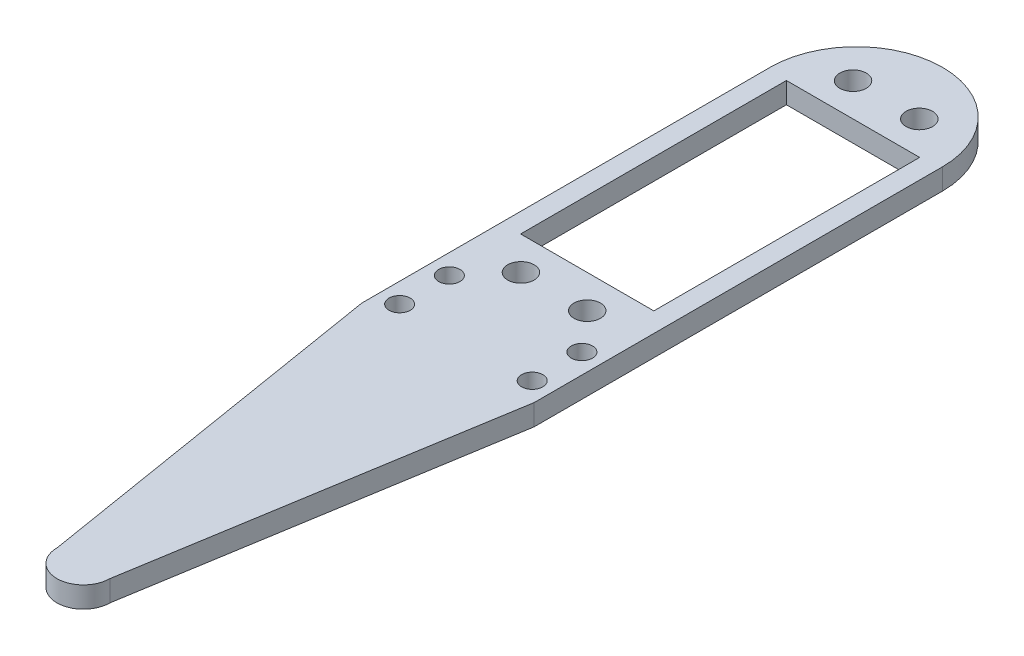
ISO-10303-21;
HEADER;
FILE_DESCRIPTION(('STEP AP214'),'2;1');
FILE_NAME('part.step','',(''),(''),'','','');
FILE_SCHEMA(('AUTOMOTIVE_DESIGN { 1 0 10303 214 1 1 1 1 }'));
ENDSEC;
DATA;
#1=APPLICATION_CONTEXT('core data for automotive mechanical design processes');
#2=APPLICATION_PROTOCOL_DEFINITION('international standard','automotive_design',2000,#1);
#3=PRODUCT_CONTEXT('',#1,'mechanical');
#4=PRODUCT('Part','Part','',(#3));
#5=PRODUCT_RELATED_PRODUCT_CATEGORY('part','',(#4));
#6=PRODUCT_DEFINITION_FORMATION('','',#4);
#7=PRODUCT_DEFINITION_CONTEXT('part definition',#1,'design');
#8=PRODUCT_DEFINITION('design','',#6,#7);
#9=PRODUCT_DEFINITION_SHAPE('','',#8);
#10=(LENGTH_UNIT() NAMED_UNIT(*) SI_UNIT(.MILLI.,.METRE.));
#11=(NAMED_UNIT(*) PLANE_ANGLE_UNIT() SI_UNIT($,.RADIAN.));
#12=(NAMED_UNIT(*) SI_UNIT($,.STERADIAN.) SOLID_ANGLE_UNIT());
#13=UNCERTAINTY_MEASURE_WITH_UNIT(LENGTH_MEASURE(1.E-05),#10,'distance_accuracy_value','');
#14=(GEOMETRIC_REPRESENTATION_CONTEXT(3) GLOBAL_UNCERTAINTY_ASSIGNED_CONTEXT((#13)) GLOBAL_UNIT_ASSIGNED_CONTEXT((#10,
#11,#12)) REPRESENTATION_CONTEXT('',''));
#15=CARTESIAN_POINT('',(0.,0.,0.));
#16=DIRECTION('',(0.,0.,1.));
#17=DIRECTION('',(1.,0.,0.));
#18=AXIS2_PLACEMENT_3D('',#15,#16,#17);
#19=CARTESIAN_POINT('',(0.,3.175,0.));
#20=DIRECTION('',(0.,1.,0.));
#21=DIRECTION('',(0.,0.,1.));
#22=AXIS2_PLACEMENT_3D('',#19,#20,#21);
#23=PLANE('',#22);
#24=CARTESIAN_POINT('',(10.,3.175,51.4));
#25=DIRECTION('',(0.,1.,0.));
#26=DIRECTION('',(0.,0.,1.));
#27=AXIS2_PLACEMENT_3D('',#24,#25,#26);
#28=CIRCLE('',#27,1.6);
#29=CARTESIAN_POINT('',(10.,3.175,53.));
#30=VERTEX_POINT('',#29);
#31=EDGE_CURVE('E317',#30,#30,#28,.T.);
#32=ORIENTED_EDGE('',*,*,#31,.F.);
#33=EDGE_LOOP('',(#32));
#34=FACE_BOUND('',#33,.T.);
#35=CARTESIAN_POINT('',(-9.99999999999997,3.175,58.9));
#36=DIRECTION('',(0.,1.,0.));
#37=DIRECTION('',(0.,0.,1.));
#38=AXIS2_PLACEMENT_3D('',#35,#36,#37);
#39=CIRCLE('',#38,1.6);
#40=CARTESIAN_POINT('',(-9.99999999999997,3.175,60.5));
#41=VERTEX_POINT('',#40);
#42=EDGE_CURVE('E314',#41,#41,#39,.T.);
#43=ORIENTED_EDGE('',*,*,#42,.F.);
#44=EDGE_LOOP('',(#43));
#45=FACE_BOUND('',#44,.T.);
#46=CARTESIAN_POINT('',(-9.99999999999997,3.175,51.4));
#47=DIRECTION('',(0.,1.,0.));
#48=DIRECTION('',(0.,0.,1.));
#49=AXIS2_PLACEMENT_3D('',#46,#47,#48);
#50=CIRCLE('',#49,1.6);
#51=CARTESIAN_POINT('',(-9.99999999999997,3.175,53.));
#52=VERTEX_POINT('',#51);
#53=EDGE_CURVE('E294',#52,#52,#50,.T.);
#54=ORIENTED_EDGE('',*,*,#53,.F.);
#55=EDGE_LOOP('',(#54));
#56=FACE_BOUND('',#55,.T.);
#57=CARTESIAN_POINT('',(10.,3.175,58.9));
#58=DIRECTION('',(0.,1.,0.));
#59=DIRECTION('',(0.,0.,1.));
#60=AXIS2_PLACEMENT_3D('',#57,#58,#59);
#61=CIRCLE('',#60,1.6);
#62=CARTESIAN_POINT('',(10.,3.175,60.5));
#63=VERTEX_POINT('',#62);
#64=EDGE_CURVE('E310',#63,#63,#61,.T.);
#65=ORIENTED_EDGE('',*,*,#64,.F.);
#66=EDGE_LOOP('',(#65));
#67=FACE_BOUND('',#66,.T.);
#68=CARTESIAN_POINT('',(5.,3.175,45.6));
#69=DIRECTION('',(0.,1.,0.));
#70=DIRECTION('',(0.,0.,-1.));
#71=AXIS2_PLACEMENT_3D('',#68,#69,#70);
#72=CIRCLE('',#71,2.);
#73=CARTESIAN_POINT('',(5.,3.175,43.6));
#74=VERTEX_POINT('',#73);
#75=EDGE_CURVE('E139',#74,#74,#72,.T.);
#76=ORIENTED_EDGE('',*,*,#75,.F.);
#77=EDGE_LOOP('',(#76));
#78=FACE_BOUND('',#77,.T.);
#79=CARTESIAN_POINT('',(-5.,3.175,-4.5));
#80=DIRECTION('',(0.,1.,0.));
#81=DIRECTION('',(0.,0.,1.));
#82=AXIS2_PLACEMENT_3D('',#79,#80,#81);
#83=CIRCLE('',#82,2.);
#84=CARTESIAN_POINT('',(-5.,3.175,-2.5));
#85=VERTEX_POINT('',#84);
#86=EDGE_CURVE('E155',#85,#85,#83,.T.);
#87=ORIENTED_EDGE('',*,*,#86,.F.);
#88=EDGE_LOOP('',(#87));
#89=FACE_BOUND('',#88,.T.);
#90=CARTESIAN_POINT('',(0.,3.175,0.));
#91=DIRECTION('',(0.,1.,0.));
#92=DIRECTION('',(0.,0.,1.));
#93=AXIS2_PLACEMENT_3D('',#90,#91,#92);
#94=CIRCLE('',#93,13.);
#95=CARTESIAN_POINT('',(13.,3.175,0.));
#96=VERTEX_POINT('',#95);
#97=CARTESIAN_POINT('',(-13.,3.175,0.));
#98=VERTEX_POINT('',#97);
#99=EDGE_CURVE('E161',#96,#98,#94,.T.);
#100=ORIENTED_EDGE('',*,*,#99,.T.);
#101=DIRECTION('',(0.,0.,1.));
#102=VECTOR('',#101,1.);
#103=CARTESIAN_POINT('',(-13.,3.175,0.));
#104=LINE('',#103,#102);
#105=CARTESIAN_POINT('',(-13.,3.175,61.6));
#106=VERTEX_POINT('',#105);
#107=EDGE_CURVE('E164',#98,#106,#104,.T.);
#108=ORIENTED_EDGE('',*,*,#107,.T.);
#109=DIRECTION('',(0.161488568110541,0.,0.986874582897749));
#110=VECTOR('',#109,1.);
#111=CARTESIAN_POINT('',(-13.,3.175,61.6));
#112=LINE('',#111,#110);
#113=CARTESIAN_POINT('',(-3.99999999999998,3.175,116.6));
#114=VERTEX_POINT('',#113);
#115=EDGE_CURVE('E167',#106,#114,#112,.T.);
#116=ORIENTED_EDGE('',*,*,#115,.T.);
#117=CARTESIAN_POINT('',(0.,3.175,116.6));
#118=DIRECTION('',(0.,1.,0.));
#119=DIRECTION('',(0.,0.,1.));
#120=AXIS2_PLACEMENT_3D('',#117,#118,#119);
#121=CIRCLE('',#120,4.);
#122=CARTESIAN_POINT('',(4.00000000000002,3.175,116.6));
#123=VERTEX_POINT('',#122);
#124=EDGE_CURVE('E169',#114,#123,#121,.T.);
#125=ORIENTED_EDGE('',*,*,#124,.T.);
#126=DIRECTION('',(0.16148856811054,0.,-0.98687458289775));
#127=VECTOR('',#126,1.);
#128=CARTESIAN_POINT('',(13.,3.175,61.6));
#129=LINE('',#128,#127);
#130=CARTESIAN_POINT('',(13.,3.175,61.6));
#131=VERTEX_POINT('',#130);
#132=EDGE_CURVE('E171',#123,#131,#129,.T.);
#133=ORIENTED_EDGE('',*,*,#132,.T.);
#134=DIRECTION('',(0.,0.,-1.));
#135=VECTOR('',#134,1.);
#136=CARTESIAN_POINT('',(13.,3.175,0.));
#137=LINE('',#136,#135);
#138=EDGE_CURVE('E173',#131,#96,#137,.T.);
#139=ORIENTED_EDGE('',*,*,#138,.T.);
#140=EDGE_LOOP('',(#100,#108,#116,#125,#133,#139));
#141=FACE_BOUND('',#140,.T.);
#142=CARTESIAN_POINT('',(-5.,3.175,45.6));
#143=DIRECTION('',(0.,1.,0.));
#144=DIRECTION('',(0.,0.,1.));
#145=AXIS2_PLACEMENT_3D('',#142,#143,#144);
#146=CIRCLE('',#145,2.);
#147=CARTESIAN_POINT('',(-5.,3.175,47.6));
#148=VERTEX_POINT('',#147);
#149=EDGE_CURVE('E149',#148,#148,#146,.T.);
#150=ORIENTED_EDGE('',*,*,#149,.F.);
#151=EDGE_LOOP('',(#150));
#152=FACE_BOUND('',#151,.T.);
#153=DIRECTION('',(-1.,0.,0.));
#154=VECTOR('',#153,1.);
#155=CARTESIAN_POINT('',(-10.05,3.175,0.5));
#156=LINE('',#155,#154);
#157=CARTESIAN_POINT('',(10.05,3.175,0.5));
#158=VERTEX_POINT('',#157);
#159=CARTESIAN_POINT('',(-10.05,3.175,0.5));
#160=VERTEX_POINT('',#159);
#161=EDGE_CURVE('E118',#158,#160,#156,.T.);
#162=ORIENTED_EDGE('',*,*,#161,.F.);
#163=DIRECTION('',(0.,0.,-1.));
#164=VECTOR('',#163,1.);
#165=CARTESIAN_POINT('',(10.05,3.175,0.5));
#166=LINE('',#165,#164);
#167=CARTESIAN_POINT('',(10.05,3.175,40.6));
#168=VERTEX_POINT('',#167);
#169=EDGE_CURVE('E110',#168,#158,#166,.T.);
#170=ORIENTED_EDGE('',*,*,#169,.F.);
#171=DIRECTION('',(1.,0.,0.));
#172=VECTOR('',#171,1.);
#173=CARTESIAN_POINT('',(-10.05,3.175,40.6));
#174=LINE('',#173,#172);
#175=CARTESIAN_POINT('',(-10.05,3.175,40.6));
#176=VERTEX_POINT('',#175);
#177=EDGE_CURVE('E133',#176,#168,#174,.T.);
#178=ORIENTED_EDGE('',*,*,#177,.F.);
#179=DIRECTION('',(0.,0.,1.));
#180=VECTOR('',#179,1.);
#181=CARTESIAN_POINT('',(-10.05,3.175,0.5));
#182=LINE('',#181,#180);
#183=EDGE_CURVE('E131',#160,#176,#182,.T.);
#184=ORIENTED_EDGE('',*,*,#183,.F.);
#185=EDGE_LOOP('',(#162,#170,#178,#184));
#186=FACE_BOUND('',#185,.T.);
#187=CARTESIAN_POINT('',(5.,3.175,-4.5));
#188=DIRECTION('',(0.,1.,0.));
#189=DIRECTION('',(0.,0.,-1.));
#190=AXIS2_PLACEMENT_3D('',#187,#188,#189);
#191=CIRCLE('',#190,2.);
#192=CARTESIAN_POINT('',(5.,3.175,-6.5));
#193=VERTEX_POINT('',#192);
#194=EDGE_CURVE('E321',#193,#193,#191,.T.);
#195=ORIENTED_EDGE('',*,*,#194,.F.);
#196=EDGE_LOOP('',(#195));
#197=FACE_BOUND('',#196,.T.);
#198=ADVANCED_FACE('F33',(#34,#45,#56,#67,#78,#89,#141,#152,#186,#197),#23,.T.);
#199=CARTESIAN_POINT('',(0.,0.,0.));
#200=DIRECTION('',(0.,1.,0.));
#201=DIRECTION('',(0.,0.,1.));
#202=AXIS2_PLACEMENT_3D('',#199,#200,#201);
#203=PLANE('',#202);
#204=CARTESIAN_POINT('',(10.,0.,51.4));
#205=DIRECTION('',(0.,1.,0.));
#206=DIRECTION('',(0.,0.,1.));
#207=AXIS2_PLACEMENT_3D('',#204,#205,#206);
#208=CIRCLE('',#207,1.6);
#209=CARTESIAN_POINT('',(10.,0.,53.));
#210=VERTEX_POINT('',#209);
#211=EDGE_CURVE('E302',#210,#210,#208,.T.);
#212=ORIENTED_EDGE('',*,*,#211,.T.);
#213=EDGE_LOOP('',(#212));
#214=FACE_BOUND('',#213,.T.);
#215=CARTESIAN_POINT('',(-9.99999999999997,0.,58.9));
#216=DIRECTION('',(0.,1.,0.));
#217=DIRECTION('',(0.,0.,1.));
#218=AXIS2_PLACEMENT_3D('',#215,#216,#217);
#219=CIRCLE('',#218,1.6);
#220=CARTESIAN_POINT('',(-9.99999999999997,0.,60.5));
#221=VERTEX_POINT('',#220);
#222=EDGE_CURVE('E299',#221,#221,#219,.T.);
#223=ORIENTED_EDGE('',*,*,#222,.T.);
#224=EDGE_LOOP('',(#223));
#225=FACE_BOUND('',#224,.T.);
#226=CARTESIAN_POINT('',(-9.99999999999997,0.,51.4));
#227=DIRECTION('',(0.,1.,0.));
#228=DIRECTION('',(0.,0.,1.));
#229=AXIS2_PLACEMENT_3D('',#226,#227,#228);
#230=CIRCLE('',#229,1.6);
#231=CARTESIAN_POINT('',(-9.99999999999997,0.,53.));
#232=VERTEX_POINT('',#231);
#233=EDGE_CURVE('E297',#232,#232,#230,.T.);
#234=ORIENTED_EDGE('',*,*,#233,.T.);
#235=EDGE_LOOP('',(#234));
#236=FACE_BOUND('',#235,.T.);
#237=CARTESIAN_POINT('',(10.,0.,58.9));
#238=DIRECTION('',(0.,1.,0.));
#239=DIRECTION('',(0.,0.,1.));
#240=AXIS2_PLACEMENT_3D('',#237,#238,#239);
#241=CIRCLE('',#240,1.6);
#242=CARTESIAN_POINT('',(10.,0.,60.5));
#243=VERTEX_POINT('',#242);
#244=EDGE_CURVE('E306',#243,#243,#241,.T.);
#245=ORIENTED_EDGE('',*,*,#244,.T.);
#246=EDGE_LOOP('',(#245));
#247=FACE_BOUND('',#246,.T.);
#248=CARTESIAN_POINT('',(-5.,0.,45.6));
#249=DIRECTION('',(0.,1.,0.));
#250=DIRECTION('',(0.,0.,1.));
#251=AXIS2_PLACEMENT_3D('',#248,#249,#250);
#252=CIRCLE('',#251,2.);
#253=CARTESIAN_POINT('',(-5.,0.,47.6));
#254=VERTEX_POINT('',#253);
#255=EDGE_CURVE('E126',#254,#254,#252,.T.);
#256=ORIENTED_EDGE('',*,*,#255,.T.);
#257=EDGE_LOOP('',(#256));
#258=FACE_BOUND('',#257,.T.);
#259=CARTESIAN_POINT('',(-5.,0.,-4.5));
#260=DIRECTION('',(0.,1.,0.));
#261=DIRECTION('',(0.,0.,1.));
#262=AXIS2_PLACEMENT_3D('',#259,#260,#261);
#263=CIRCLE('',#262,2.);
#264=CARTESIAN_POINT('',(-5.,0.,-2.5));
#265=VERTEX_POINT('',#264);
#266=EDGE_CURVE('E152',#265,#265,#263,.T.);
#267=ORIENTED_EDGE('',*,*,#266,.T.);
#268=EDGE_LOOP('',(#267));
#269=FACE_BOUND('',#268,.T.);
#270=CARTESIAN_POINT('',(0.,0.,0.));
#271=DIRECTION('',(0.,1.,0.));
#272=DIRECTION('',(0.,0.,1.));
#273=AXIS2_PLACEMENT_3D('',#270,#271,#272);
#274=CIRCLE('',#273,13.);
#275=CARTESIAN_POINT('',(13.,0.,0.));
#276=VERTEX_POINT('',#275);
#277=CARTESIAN_POINT('',(-13.,0.,0.));
#278=VERTEX_POINT('',#277);
#279=EDGE_CURVE('E158',#276,#278,#274,.T.);
#280=ORIENTED_EDGE('',*,*,#279,.F.);
#281=DIRECTION('',(0.,0.,-1.));
#282=VECTOR('',#281,1.);
#283=CARTESIAN_POINT('',(13.,0.,0.));
#284=LINE('',#283,#282);
#285=CARTESIAN_POINT('',(13.,0.,61.6));
#286=VERTEX_POINT('',#285);
#287=EDGE_CURVE('E165',#286,#276,#284,.T.);
#288=ORIENTED_EDGE('',*,*,#287,.F.);
#289=DIRECTION('',(0.16148856811054,0.,-0.98687458289775));
#290=VECTOR('',#289,1.);
#291=CARTESIAN_POINT('',(13.,0.,61.6));
#292=LINE('',#291,#290);
#293=CARTESIAN_POINT('',(4.00000000000002,0.,116.6));
#294=VERTEX_POINT('',#293);
#295=EDGE_CURVE('E184',#294,#286,#292,.T.);
#296=ORIENTED_EDGE('',*,*,#295,.F.);
#297=CARTESIAN_POINT('',(0.,0.,116.6));
#298=DIRECTION('',(0.,1.,0.));
#299=DIRECTION('',(0.,0.,1.));
#300=AXIS2_PLACEMENT_3D('',#297,#298,#299);
#301=CIRCLE('',#300,4.);
#302=CARTESIAN_POINT('',(-3.99999999999998,0.,116.6));
#303=VERTEX_POINT('',#302);
#304=EDGE_CURVE('E182',#303,#294,#301,.T.);
#305=ORIENTED_EDGE('',*,*,#304,.F.);
#306=DIRECTION('',(0.161488568110541,0.,0.986874582897749));
#307=VECTOR('',#306,1.);
#308=CARTESIAN_POINT('',(-13.,0.,61.6));
#309=LINE('',#308,#307);
#310=CARTESIAN_POINT('',(-13.,0.,61.6));
#311=VERTEX_POINT('',#310);
#312=EDGE_CURVE('E180',#311,#303,#309,.T.);
#313=ORIENTED_EDGE('',*,*,#312,.F.);
#314=DIRECTION('',(0.,0.,1.));
#315=VECTOR('',#314,1.);
#316=CARTESIAN_POINT('',(-13.,0.,0.));
#317=LINE('',#316,#315);
#318=EDGE_CURVE('E178',#278,#311,#317,.T.);
#319=ORIENTED_EDGE('',*,*,#318,.F.);
#320=EDGE_LOOP('',(#280,#288,#296,#305,#313,#319));
#321=FACE_BOUND('',#320,.T.);
#322=DIRECTION('',(0.,0.,-1.));
#323=VECTOR('',#322,1.);
#324=CARTESIAN_POINT('',(10.05,0.,0.5));
#325=LINE('',#324,#323);
#326=CARTESIAN_POINT('',(10.05,0.,40.6));
#327=VERTEX_POINT('',#326);
#328=CARTESIAN_POINT('',(10.05,0.,0.5));
#329=VERTEX_POINT('',#328);
#330=EDGE_CURVE('E56',#327,#329,#325,.T.);
#331=ORIENTED_EDGE('',*,*,#330,.T.);
#332=DIRECTION('',(-1.,0.,0.));
#333=VECTOR('',#332,1.);
#334=CARTESIAN_POINT('',(-10.05,0.,0.5));
#335=LINE('',#334,#333);
#336=CARTESIAN_POINT('',(-10.05,0.,0.5));
#337=VERTEX_POINT('',#336);
#338=EDGE_CURVE('E125',#329,#337,#335,.T.);
#339=ORIENTED_EDGE('',*,*,#338,.T.);
#340=DIRECTION('',(0.,0.,1.));
#341=VECTOR('',#340,1.);
#342=CARTESIAN_POINT('',(-10.05,0.,0.5));
#343=LINE('',#342,#341);
#344=CARTESIAN_POINT('',(-10.05,0.,40.6));
#345=VERTEX_POINT('',#344);
#346=EDGE_CURVE('E141',#337,#345,#343,.T.);
#347=ORIENTED_EDGE('',*,*,#346,.T.);
#348=DIRECTION('',(1.,0.,0.));
#349=VECTOR('',#348,1.);
#350=CARTESIAN_POINT('',(-10.05,0.,40.6));
#351=LINE('',#350,#349);
#352=EDGE_CURVE('E119',#345,#327,#351,.T.);
#353=ORIENTED_EDGE('',*,*,#352,.T.);
#354=EDGE_LOOP('',(#331,#339,#347,#353));
#355=FACE_BOUND('',#354,.T.);
#356=CARTESIAN_POINT('',(5.,0.,45.6));
#357=DIRECTION('',(0.,1.,0.));
#358=DIRECTION('',(0.,0.,-1.));
#359=AXIS2_PLACEMENT_3D('',#356,#357,#358);
#360=CIRCLE('',#359,2.);
#361=CARTESIAN_POINT('',(5.,0.,43.6));
#362=VERTEX_POINT('',#361);
#363=EDGE_CURVE('E324',#362,#362,#360,.T.);
#364=ORIENTED_EDGE('',*,*,#363,.T.);
#365=EDGE_LOOP('',(#364));
#366=FACE_BOUND('',#365,.T.);
#367=CARTESIAN_POINT('',(5.,0.,-4.5));
#368=DIRECTION('',(0.,1.,0.));
#369=DIRECTION('',(0.,0.,-1.));
#370=AXIS2_PLACEMENT_3D('',#367,#368,#369);
#371=CIRCLE('',#370,2.);
#372=CARTESIAN_POINT('',(5.,0.,-6.5));
#373=VERTEX_POINT('',#372);
#374=EDGE_CURVE('E320',#373,#373,#371,.T.);
#375=ORIENTED_EDGE('',*,*,#374,.T.);
#376=EDGE_LOOP('',(#375));
#377=FACE_BOUND('',#376,.T.);
#378=ADVANCED_FACE('F208',(#214,#225,#236,#247,#258,#269,#321,#355,#366,#377),#203,.F.);
#379=CARTESIAN_POINT('',(0.,3.175,0.));
#380=DIRECTION('',(0.,-1.,0.));
#381=DIRECTION('',(0.,0.,-1.));
#382=AXIS2_PLACEMENT_3D('',#379,#380,#381);
#383=CYLINDRICAL_SURFACE('',#382,13.);
#384=ORIENTED_EDGE('',*,*,#279,.T.);
#385=DIRECTION('',(0.,-1.,0.));
#386=VECTOR('',#385,1.);
#387=CARTESIAN_POINT('',(-13.,3.175,0.));
#388=LINE('',#387,#386);
#389=EDGE_CURVE('E11',#98,#278,#388,.T.);
#390=ORIENTED_EDGE('',*,*,#389,.F.);
#391=ORIENTED_EDGE('',*,*,#99,.F.);
#392=DIRECTION('',(0.,-1.,0.));
#393=VECTOR('',#392,1.);
#394=CARTESIAN_POINT('',(13.,3.175,0.));
#395=LINE('',#394,#393);
#396=EDGE_CURVE('E175',#96,#276,#395,.T.);
#397=ORIENTED_EDGE('',*,*,#396,.T.);
#398=EDGE_LOOP('',(#384,#390,#391,#397));
#399=FACE_BOUND('',#398,.T.);
#400=ADVANCED_FACE('F35',(#399),#383,.T.);
#401=CARTESIAN_POINT('',(-13.,3.175,0.));
#402=DIRECTION('',(1.,0.,0.));
#403=DIRECTION('',(0.,0.,-1.));
#404=AXIS2_PLACEMENT_3D('',#401,#402,#403);
#405=PLANE('',#404);
#406=ORIENTED_EDGE('',*,*,#318,.T.);
#407=DIRECTION('',(0.,-1.,0.));
#408=VECTOR('',#407,1.);
#409=CARTESIAN_POINT('',(-13.,3.175,61.6));
#410=LINE('',#409,#408);
#411=EDGE_CURVE('E41',#106,#311,#410,.T.);
#412=ORIENTED_EDGE('',*,*,#411,.F.);
#413=ORIENTED_EDGE('',*,*,#107,.F.);
#414=ORIENTED_EDGE('',*,*,#389,.T.);
#415=EDGE_LOOP('',(#406,#412,#413,#414));
#416=FACE_BOUND('',#415,.T.);
#417=ADVANCED_FACE('F226',(#416),#405,.F.);
#418=CARTESIAN_POINT('',(-13.,3.175,61.6));
#419=DIRECTION('',(0.98687458289775,0.,-0.161488568110541));
#420=DIRECTION('',(-0.161488568110541,0.,-0.98687458289775));
#421=AXIS2_PLACEMENT_3D('',#418,#419,#420);
#422=PLANE('',#421);
#423=ORIENTED_EDGE('',*,*,#312,.T.);
#424=DIRECTION('',(0.,-1.,0.));
#425=VECTOR('',#424,1.);
#426=CARTESIAN_POINT('',(-3.99999999999998,3.175,116.6));
#427=LINE('',#426,#425);
#428=EDGE_CURVE('E195',#114,#303,#427,.T.);
#429=ORIENTED_EDGE('',*,*,#428,.F.);
#430=ORIENTED_EDGE('',*,*,#115,.F.);
#431=ORIENTED_EDGE('',*,*,#411,.T.);
#432=EDGE_LOOP('',(#423,#429,#430,#431));
#433=FACE_BOUND('',#432,.T.);
#434=ADVANCED_FACE('F202',(#433),#422,.F.);
#435=CARTESIAN_POINT('',(0.,3.175,116.6));
#436=DIRECTION('',(0.,-1.,0.));
#437=DIRECTION('',(0.,0.,-1.));
#438=AXIS2_PLACEMENT_3D('',#435,#436,#437);
#439=CYLINDRICAL_SURFACE('',#438,4.);
#440=ORIENTED_EDGE('',*,*,#304,.T.);
#441=DIRECTION('',(0.,-1.,0.));
#442=VECTOR('',#441,1.);
#443=CARTESIAN_POINT('',(4.00000000000002,3.175,116.6));
#444=LINE('',#443,#442);
#445=EDGE_CURVE('E192',#123,#294,#444,.T.);
#446=ORIENTED_EDGE('',*,*,#445,.F.);
#447=ORIENTED_EDGE('',*,*,#124,.F.);
#448=ORIENTED_EDGE('',*,*,#428,.T.);
#449=EDGE_LOOP('',(#440,#446,#447,#448));
#450=FACE_BOUND('',#449,.T.);
#451=ADVANCED_FACE('F214',(#450),#439,.T.);
#452=CARTESIAN_POINT('',(13.,3.175,61.6));
#453=DIRECTION('',(-0.98687458289775,0.,-0.16148856811054));
#454=DIRECTION('',(-0.16148856811054,0.,0.98687458289775));
#455=AXIS2_PLACEMENT_3D('',#452,#453,#454);
#456=PLANE('',#455);
#457=ORIENTED_EDGE('',*,*,#295,.T.);
#458=DIRECTION('',(0.,-1.,0.));
#459=VECTOR('',#458,1.);
#460=CARTESIAN_POINT('',(13.,3.175,61.6));
#461=LINE('',#460,#459);
#462=EDGE_CURVE('E189',#131,#286,#461,.T.);
#463=ORIENTED_EDGE('',*,*,#462,.F.);
#464=ORIENTED_EDGE('',*,*,#132,.F.);
#465=ORIENTED_EDGE('',*,*,#445,.T.);
#466=EDGE_LOOP('',(#457,#463,#464,#465));
#467=FACE_BOUND('',#466,.T.);
#468=ADVANCED_FACE('F218',(#467),#456,.F.);
#469=CARTESIAN_POINT('',(13.,3.175,0.));
#470=DIRECTION('',(-1.,0.,0.));
#471=DIRECTION('',(0.,0.,1.));
#472=AXIS2_PLACEMENT_3D('',#469,#470,#471);
#473=PLANE('',#472);
#474=ORIENTED_EDGE('',*,*,#287,.T.);
#475=ORIENTED_EDGE('',*,*,#396,.F.);
#476=ORIENTED_EDGE('',*,*,#138,.F.);
#477=ORIENTED_EDGE('',*,*,#462,.T.);
#478=EDGE_LOOP('',(#474,#475,#476,#477));
#479=FACE_BOUND('',#478,.T.);
#480=ADVANCED_FACE('F229',(#479),#473,.F.);
#481=CARTESIAN_POINT('',(-5.,3.175,-4.5));
#482=DIRECTION('',(0.,-1.,0.));
#483=DIRECTION('',(0.,0.,-1.));
#484=AXIS2_PLACEMENT_3D('',#481,#482,#483);
#485=CYLINDRICAL_SURFACE('',#484,2.);
#486=ORIENTED_EDGE('',*,*,#86,.T.);
#487=EDGE_LOOP('',(#486));
#488=FACE_BOUND('',#487,.T.);
#489=ORIENTED_EDGE('',*,*,#266,.F.);
#490=EDGE_LOOP('',(#489));
#491=FACE_BOUND('',#490,.T.);
#492=ADVANCED_FACE('F231',(#488,#491),#485,.F.);
#493=CARTESIAN_POINT('',(-5.,3.175,45.6));
#494=DIRECTION('',(0.,-1.,0.));
#495=DIRECTION('',(0.,0.,-1.));
#496=AXIS2_PLACEMENT_3D('',#493,#494,#495);
#497=CYLINDRICAL_SURFACE('',#496,2.);
#498=ORIENTED_EDGE('',*,*,#149,.T.);
#499=EDGE_LOOP('',(#498));
#500=FACE_BOUND('',#499,.T.);
#501=ORIENTED_EDGE('',*,*,#255,.F.);
#502=EDGE_LOOP('',(#501));
#503=FACE_BOUND('',#502,.T.);
#504=ADVANCED_FACE('F237',(#500,#503),#497,.F.);
#505=CARTESIAN_POINT('',(10.05,3.175,0.5));
#506=DIRECTION('',(-1.,0.,0.));
#507=DIRECTION('',(0.,0.,1.));
#508=AXIS2_PLACEMENT_3D('',#505,#506,#507);
#509=PLANE('',#508);
#510=ORIENTED_EDGE('',*,*,#330,.F.);
#511=DIRECTION('',(0.,-1.,0.));
#512=VECTOR('',#511,1.);
#513=CARTESIAN_POINT('',(10.05,3.175,40.6));
#514=LINE('',#513,#512);
#515=EDGE_CURVE('E114',#168,#327,#514,.T.);
#516=ORIENTED_EDGE('',*,*,#515,.F.);
#517=ORIENTED_EDGE('',*,*,#169,.T.);
#518=DIRECTION('',(0.,-1.,0.));
#519=VECTOR('',#518,1.);
#520=CARTESIAN_POINT('',(10.05,3.175,0.5));
#521=LINE('',#520,#519);
#522=EDGE_CURVE('E113',#158,#329,#521,.T.);
#523=ORIENTED_EDGE('',*,*,#522,.T.);
#524=EDGE_LOOP('',(#510,#516,#517,#523));
#525=FACE_BOUND('',#524,.T.);
#526=ADVANCED_FACE('F112',(#525),#509,.T.);
#527=CARTESIAN_POINT('',(-10.05,3.175,0.5));
#528=DIRECTION('',(0.,0.,1.));
#529=DIRECTION('',(1.,0.,0.));
#530=AXIS2_PLACEMENT_3D('',#527,#528,#529);
#531=PLANE('',#530);
#532=ORIENTED_EDGE('',*,*,#338,.F.);
#533=ORIENTED_EDGE('',*,*,#522,.F.);
#534=ORIENTED_EDGE('',*,*,#161,.T.);
#535=DIRECTION('',(0.,-1.,0.));
#536=VECTOR('',#535,1.);
#537=CARTESIAN_POINT('',(-10.05,3.175,0.5));
#538=LINE('',#537,#536);
#539=EDGE_CURVE('E127',#160,#337,#538,.T.);
#540=ORIENTED_EDGE('',*,*,#539,.T.);
#541=EDGE_LOOP('',(#532,#533,#534,#540));
#542=FACE_BOUND('',#541,.T.);
#543=ADVANCED_FACE('F122',(#542),#531,.T.);
#544=CARTESIAN_POINT('',(-10.05,3.175,0.5));
#545=DIRECTION('',(1.,0.,0.));
#546=DIRECTION('',(0.,0.,-1.));
#547=AXIS2_PLACEMENT_3D('',#544,#545,#546);
#548=PLANE('',#547);
#549=ORIENTED_EDGE('',*,*,#346,.F.);
#550=ORIENTED_EDGE('',*,*,#539,.F.);
#551=ORIENTED_EDGE('',*,*,#183,.T.);
#552=DIRECTION('',(0.,-1.,0.));
#553=VECTOR('',#552,1.);
#554=CARTESIAN_POINT('',(-10.05,3.175,40.6));
#555=LINE('',#554,#553);
#556=EDGE_CURVE('E48',#176,#345,#555,.T.);
#557=ORIENTED_EDGE('',*,*,#556,.T.);
#558=EDGE_LOOP('',(#549,#550,#551,#557));
#559=FACE_BOUND('',#558,.T.);
#560=ADVANCED_FACE('F259',(#559),#548,.T.);
#561=CARTESIAN_POINT('',(-10.05,3.175,40.6));
#562=DIRECTION('',(0.,0.,-1.));
#563=DIRECTION('',(-1.,0.,0.));
#564=AXIS2_PLACEMENT_3D('',#561,#562,#563);
#565=PLANE('',#564);
#566=ORIENTED_EDGE('',*,*,#352,.F.);
#567=ORIENTED_EDGE('',*,*,#556,.F.);
#568=ORIENTED_EDGE('',*,*,#177,.T.);
#569=ORIENTED_EDGE('',*,*,#515,.T.);
#570=EDGE_LOOP('',(#566,#567,#568,#569));
#571=FACE_BOUND('',#570,.T.);
#572=ADVANCED_FACE('F262',(#571),#565,.T.);
#573=CARTESIAN_POINT('',(5.,3.175,45.6));
#574=DIRECTION('',(0.,-1.,0.));
#575=DIRECTION('',(0.,0.,-1.));
#576=AXIS2_PLACEMENT_3D('',#573,#574,#575);
#577=CYLINDRICAL_SURFACE('',#576,2.);
#578=ORIENTED_EDGE('',*,*,#75,.T.);
#579=EDGE_LOOP('',(#578));
#580=FACE_BOUND('',#579,.T.);
#581=ORIENTED_EDGE('',*,*,#363,.F.);
#582=EDGE_LOOP('',(#581));
#583=FACE_BOUND('',#582,.T.);
#584=ADVANCED_FACE('F266',(#580,#583),#577,.F.);
#585=CARTESIAN_POINT('',(5.,3.175,-4.5));
#586=DIRECTION('',(0.,-1.,0.));
#587=DIRECTION('',(0.,0.,-1.));
#588=AXIS2_PLACEMENT_3D('',#585,#586,#587);
#589=CYLINDRICAL_SURFACE('',#588,2.);
#590=ORIENTED_EDGE('',*,*,#194,.T.);
#591=EDGE_LOOP('',(#590));
#592=FACE_BOUND('',#591,.T.);
#593=ORIENTED_EDGE('',*,*,#374,.F.);
#594=EDGE_LOOP('',(#593));
#595=FACE_BOUND('',#594,.T.);
#596=ADVANCED_FACE('F269',(#592,#595),#589,.F.);
#597=CARTESIAN_POINT('',(10.,0.,58.9));
#598=DIRECTION('',(0.,1.,0.));
#599=DIRECTION('',(0.,0.,1.));
#600=AXIS2_PLACEMENT_3D('',#597,#598,#599);
#601=CYLINDRICAL_SURFACE('',#600,1.6);
#602=ORIENTED_EDGE('',*,*,#64,.T.);
#603=EDGE_LOOP('',(#602));
#604=FACE_BOUND('',#603,.T.);
#605=ORIENTED_EDGE('',*,*,#244,.F.);
#606=EDGE_LOOP('',(#605));
#607=FACE_BOUND('',#606,.T.);
#608=ADVANCED_FACE('F273',(#604,#607),#601,.F.);
#609=CARTESIAN_POINT('',(-9.99999999999997,0.,51.4));
#610=DIRECTION('',(0.,1.,0.));
#611=DIRECTION('',(0.,0.,1.));
#612=AXIS2_PLACEMENT_3D('',#609,#610,#611);
#613=CYLINDRICAL_SURFACE('',#612,1.6);
#614=ORIENTED_EDGE('',*,*,#53,.T.);
#615=EDGE_LOOP('',(#614));
#616=FACE_BOUND('',#615,.T.);
#617=ORIENTED_EDGE('',*,*,#233,.F.);
#618=EDGE_LOOP('',(#617));
#619=FACE_BOUND('',#618,.T.);
#620=ADVANCED_FACE('F277',(#616,#619),#613,.F.);
#621=CARTESIAN_POINT('',(-9.99999999999997,0.,58.9));
#622=DIRECTION('',(0.,1.,0.));
#623=DIRECTION('',(0.,0.,1.));
#624=AXIS2_PLACEMENT_3D('',#621,#622,#623);
#625=CYLINDRICAL_SURFACE('',#624,1.6);
#626=ORIENTED_EDGE('',*,*,#42,.T.);
#627=EDGE_LOOP('',(#626));
#628=FACE_BOUND('',#627,.T.);
#629=ORIENTED_EDGE('',*,*,#222,.F.);
#630=EDGE_LOOP('',(#629));
#631=FACE_BOUND('',#630,.T.);
#632=ADVANCED_FACE('F279',(#628,#631),#625,.F.);
#633=CARTESIAN_POINT('',(10.,0.,51.4));
#634=DIRECTION('',(0.,1.,0.));
#635=DIRECTION('',(0.,0.,1.));
#636=AXIS2_PLACEMENT_3D('',#633,#634,#635);
#637=CYLINDRICAL_SURFACE('',#636,1.6);
#638=ORIENTED_EDGE('',*,*,#31,.T.);
#639=EDGE_LOOP('',(#638));
#640=FACE_BOUND('',#639,.T.);
#641=ORIENTED_EDGE('',*,*,#211,.F.);
#642=EDGE_LOOP('',(#641));
#643=FACE_BOUND('',#642,.T.);
#644=ADVANCED_FACE('F282',(#640,#643),#637,.F.);
#645=CLOSED_SHELL('',(#198,#378,#400,#417,#434,#451,#468,#480,#492,#504,#526,#543,#560,#572,
#584,#596,#608,#620,#632,#644));
#646=MANIFOLD_SOLID_BREP('B2',#645);
#647=ADVANCED_BREP_SHAPE_REPRESENTATION('',(#18,#646),#14);
#648=SHAPE_DEFINITION_REPRESENTATION(#9,#647);
ENDSEC;
END-ISO-10303-21;
